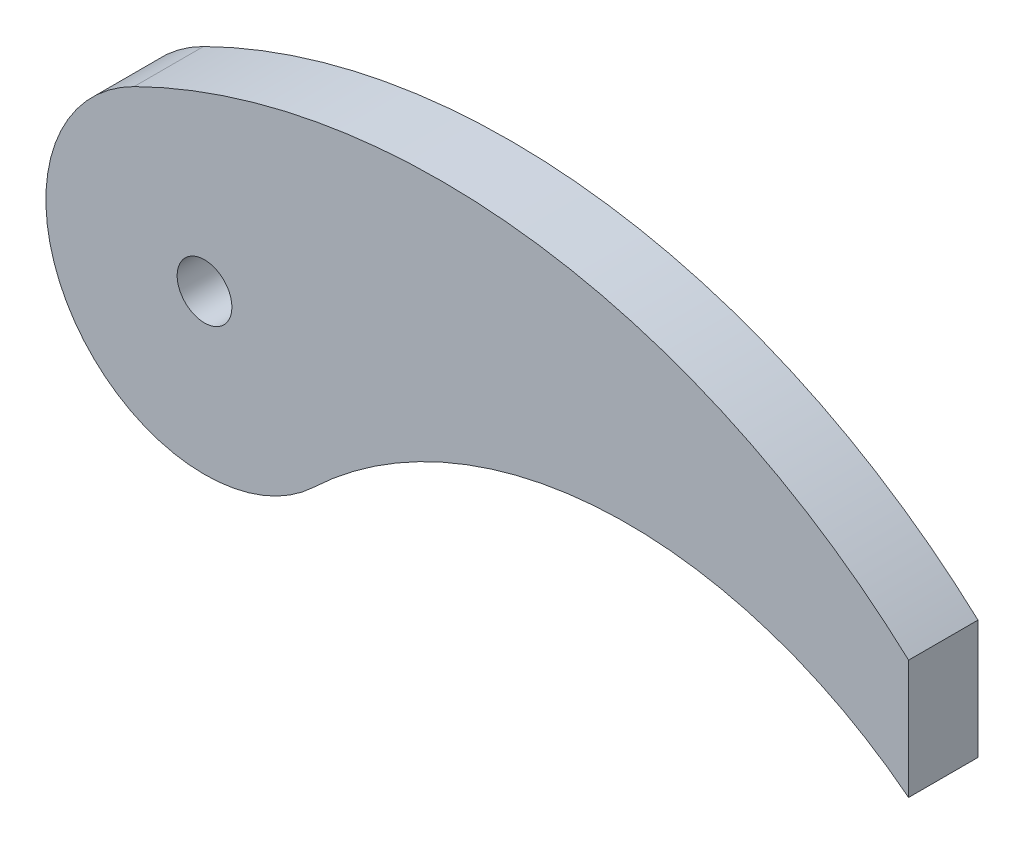
ISO-10303-21;
HEADER;
FILE_DESCRIPTION(('STEP AP214'),'2;1');
FILE_NAME('part.step','',(''),(''),'','','');
FILE_SCHEMA(('AUTOMOTIVE_DESIGN { 1 0 10303 214 1 1 1 1 }'));
ENDSEC;
DATA;
#1=APPLICATION_CONTEXT('core data for automotive mechanical design processes');
#2=APPLICATION_PROTOCOL_DEFINITION('international standard','automotive_design',2000,#1);
#3=PRODUCT_CONTEXT('',#1,'mechanical');
#4=PRODUCT('Part','Part','',(#3));
#5=PRODUCT_RELATED_PRODUCT_CATEGORY('part','',(#4));
#6=PRODUCT_DEFINITION_FORMATION('','',#4);
#7=PRODUCT_DEFINITION_CONTEXT('part definition',#1,'design');
#8=PRODUCT_DEFINITION('design','',#6,#7);
#9=PRODUCT_DEFINITION_SHAPE('','',#8);
#10=(LENGTH_UNIT() NAMED_UNIT(*) SI_UNIT(.MILLI.,.METRE.));
#11=(NAMED_UNIT(*) PLANE_ANGLE_UNIT() SI_UNIT($,.RADIAN.));
#12=(NAMED_UNIT(*) SI_UNIT($,.STERADIAN.) SOLID_ANGLE_UNIT());
#13=UNCERTAINTY_MEASURE_WITH_UNIT(LENGTH_MEASURE(1.E-05),#10,'distance_accuracy_value','');
#14=(GEOMETRIC_REPRESENTATION_CONTEXT(3) GLOBAL_UNCERTAINTY_ASSIGNED_CONTEXT((#13)) GLOBAL_UNIT_ASSIGNED_CONTEXT((#10,
#11,#12)) REPRESENTATION_CONTEXT('',''));
#15=CARTESIAN_POINT('',(0.,0.,0.));
#16=DIRECTION('',(0.,0.,1.));
#17=DIRECTION('',(1.,0.,0.));
#18=AXIS2_PLACEMENT_3D('',#15,#16,#17);
#19=CARTESIAN_POINT('',(15.1734038962011,-30.6249165942692,4.445));
#20=DIRECTION('',(0.,0.,-1.));
#21=DIRECTION('',(-1.,0.,0.));
#22=AXIS2_PLACEMENT_3D('',#19,#20,#21);
#23=CYLINDRICAL_SURFACE('',#22,44.337736938001);
#24=CARTESIAN_POINT('',(15.1734038962011,-30.6249165942692,0.));
#25=DIRECTION('',(0.,0.,1.));
#26=DIRECTION('',(1.,0.,0.));
#27=AXIS2_PLACEMENT_3D('',#24,#25,#26);
#28=CIRCLE('',#27,44.337736938001);
#29=CARTESIAN_POINT('',(-4.51059073528056,9.10385474504076,0.));
#30=VERTEX_POINT('',#29);
#31=CARTESIAN_POINT('',(45.0970533237348,2.09220616616686,0.));
#32=VERTEX_POINT('',#31);
#33=EDGE_CURVE('E101',#30,#32,#28,.F.);
#34=ORIENTED_EDGE('',*,*,#33,.F.);
#35=DIRECTION('',(0.,0.,-1.));
#36=VECTOR('',#35,1.);
#37=CARTESIAN_POINT('',(-4.51059073528056,9.10385474504076,4.445));
#38=LINE('',#37,#36);
#39=CARTESIAN_POINT('',(-4.51059073528056,9.10385474504076,4.445));
#40=VERTEX_POINT('',#39);
#41=EDGE_CURVE('E11',#40,#30,#38,.T.);
#42=ORIENTED_EDGE('',*,*,#41,.F.);
#43=CARTESIAN_POINT('',(15.1734038962011,-30.6249165942692,4.445));
#44=DIRECTION('',(0.,0.,1.));
#45=DIRECTION('',(1.,0.,0.));
#46=AXIS2_PLACEMENT_3D('',#43,#44,#45);
#47=CIRCLE('',#46,44.337736938001);
#48=CARTESIAN_POINT('',(45.0970533237348,2.09220616616686,4.445));
#49=VERTEX_POINT('',#48);
#50=EDGE_CURVE('E83',#40,#49,#47,.F.);
#51=ORIENTED_EDGE('',*,*,#50,.T.);
#52=DIRECTION('',(0.,0.,-1.));
#53=VECTOR('',#52,1.);
#54=CARTESIAN_POINT('',(45.0970533237348,2.09220616616686,4.445));
#55=LINE('',#54,#53);
#56=EDGE_CURVE('E50',#49,#32,#55,.T.);
#57=ORIENTED_EDGE('',*,*,#56,.T.);
#58=EDGE_LOOP('',(#34,#42,#51,#57));
#59=FACE_BOUND('',#58,.T.);
#60=ADVANCED_FACE('F34',(#59),#23,.T.);
#61=CARTESIAN_POINT('',(0.,0.,4.445));
#62=DIRECTION('',(0.,0.,-1.));
#63=DIRECTION('',(-1.,0.,0.));
#64=AXIS2_PLACEMENT_3D('',#61,#62,#63);
#65=CYLINDRICAL_SURFACE('',#64,10.16);
#66=CARTESIAN_POINT('',(0.,0.,0.));
#67=DIRECTION('',(0.,0.,1.));
#68=DIRECTION('',(1.,0.,0.));
#69=AXIS2_PLACEMENT_3D('',#66,#67,#68);
#70=CIRCLE('',#69,10.16);
#71=CARTESIAN_POINT('',(6.99705332373475,-7.3666033410801,0.));
#72=VERTEX_POINT('',#71);
#73=EDGE_CURVE('E89',#30,#72,#70,.T.);
#74=ORIENTED_EDGE('',*,*,#73,.T.);
#75=DIRECTION('',(0.,0.,-1.));
#76=VECTOR('',#75,1.);
#77=CARTESIAN_POINT('',(6.99705332373475,-7.3666033410801,4.445));
#78=LINE('',#77,#76);
#79=CARTESIAN_POINT('',(6.99705332373475,-7.3666033410801,4.445));
#80=VERTEX_POINT('',#79);
#81=EDGE_CURVE('E42',#80,#72,#78,.T.);
#82=ORIENTED_EDGE('',*,*,#81,.F.);
#83=CARTESIAN_POINT('',(0.,0.,4.445));
#84=DIRECTION('',(0.,0.,1.));
#85=DIRECTION('',(1.,0.,0.));
#86=AXIS2_PLACEMENT_3D('',#83,#84,#85);
#87=CIRCLE('',#86,10.16);
#88=EDGE_CURVE('E76',#40,#80,#87,.T.);
#89=ORIENTED_EDGE('',*,*,#88,.F.);
#90=ORIENTED_EDGE('',*,*,#41,.T.);
#91=EDGE_LOOP('',(#74,#82,#89,#90));
#92=FACE_BOUND('',#91,.T.);
#93=ADVANCED_FACE('F87',(#92),#65,.T.);
#94=CARTESIAN_POINT('',(27.1135816294722,-28.5455879466854,4.445));
#95=DIRECTION('',(0.,0.,-1.));
#96=DIRECTION('',(-1.,0.,0.));
#97=AXIS2_PLACEMENT_3D('',#94,#95,#96);
#98=CYLINDRICAL_SURFACE('',#97,29.21);
#99=CARTESIAN_POINT('',(27.1135816294722,-28.5455879466854,0.));
#100=DIRECTION('',(0.,0.,1.));
#101=DIRECTION('',(1.,0.,0.));
#102=AXIS2_PLACEMENT_3D('',#99,#100,#101);
#103=CIRCLE('',#102,29.21);
#104=CARTESIAN_POINT('',(45.0970533237348,-5.52779383383314,0.));
#105=VERTEX_POINT('',#104);
#106=EDGE_CURVE('E104',#72,#105,#103,.F.);
#107=ORIENTED_EDGE('',*,*,#106,.T.);
#108=DIRECTION('',(0.,0.,-1.));
#109=VECTOR('',#108,1.);
#110=CARTESIAN_POINT('',(45.0970533237348,-5.52779383383314,4.445));
#111=LINE('',#110,#109);
#112=CARTESIAN_POINT('',(45.0970533237348,-5.52779383383314,4.445));
#113=VERTEX_POINT('',#112);
#114=EDGE_CURVE('E64',#113,#105,#111,.T.);
#115=ORIENTED_EDGE('',*,*,#114,.F.);
#116=CARTESIAN_POINT('',(27.1135816294722,-28.5455879466854,4.445));
#117=DIRECTION('',(0.,0.,1.));
#118=DIRECTION('',(1.,0.,0.));
#119=AXIS2_PLACEMENT_3D('',#116,#117,#118);
#120=CIRCLE('',#119,29.21);
#121=EDGE_CURVE('E82',#80,#113,#120,.F.);
#122=ORIENTED_EDGE('',*,*,#121,.F.);
#123=ORIENTED_EDGE('',*,*,#81,.T.);
#124=EDGE_LOOP('',(#107,#115,#122,#123));
#125=FACE_BOUND('',#124,.T.);
#126=ADVANCED_FACE('F92',(#125),#98,.F.);
#127=CARTESIAN_POINT('',(45.0970533237348,0.,4.445));
#128=DIRECTION('',(1.,0.,0.));
#129=DIRECTION('',(0.,0.,-1.));
#130=AXIS2_PLACEMENT_3D('',#127,#128,#129);
#131=PLANE('',#130);
#132=DIRECTION('',(0.,-1.,0.));
#133=VECTOR('',#132,1.);
#134=CARTESIAN_POINT('',(45.0970533237348,0.,0.));
#135=LINE('',#134,#133);
#136=EDGE_CURVE('E106',#32,#105,#135,.T.);
#137=ORIENTED_EDGE('',*,*,#136,.F.);
#138=ORIENTED_EDGE('',*,*,#56,.F.);
#139=DIRECTION('',(0.,-1.,0.));
#140=VECTOR('',#139,1.);
#141=CARTESIAN_POINT('',(45.0970533237348,0.,4.445));
#142=LINE('',#141,#140);
#143=EDGE_CURVE('E93',#49,#113,#142,.T.);
#144=ORIENTED_EDGE('',*,*,#143,.T.);
#145=ORIENTED_EDGE('',*,*,#114,.T.);
#146=EDGE_LOOP('',(#137,#138,#144,#145));
#147=FACE_BOUND('',#146,.T.);
#148=ADVANCED_FACE('F115',(#147),#131,.T.);
#149=CARTESIAN_POINT('',(0.,0.,4.445));
#150=DIRECTION('',(0.,0.,-1.));
#151=DIRECTION('',(-1.,0.,0.));
#152=AXIS2_PLACEMENT_3D('',#149,#150,#151);
#153=CYLINDRICAL_SURFACE('',#152,1.7526);
#154=CARTESIAN_POINT('',(0.,0.,4.445));
#155=DIRECTION('',(0.,0.,1.));
#156=DIRECTION('',(1.,0.,0.));
#157=AXIS2_PLACEMENT_3D('',#154,#155,#156);
#158=CIRCLE('',#157,1.7526);
#159=CARTESIAN_POINT('',(1.7526,0.,4.445));
#160=VERTEX_POINT('',#159);
#161=EDGE_CURVE('E95',#160,#160,#158,.T.);
#162=ORIENTED_EDGE('',*,*,#161,.T.);
#163=EDGE_LOOP('',(#162));
#164=FACE_BOUND('',#163,.T.);
#165=CARTESIAN_POINT('',(0.,0.,0.));
#166=DIRECTION('',(0.,0.,1.));
#167=DIRECTION('',(1.,0.,0.));
#168=AXIS2_PLACEMENT_3D('',#165,#166,#167);
#169=CIRCLE('',#168,1.7526);
#170=CARTESIAN_POINT('',(1.7526,0.,0.));
#171=VERTEX_POINT('',#170);
#172=EDGE_CURVE('E109',#171,#171,#169,.T.);
#173=ORIENTED_EDGE('',*,*,#172,.F.);
#174=EDGE_LOOP('',(#173));
#175=FACE_BOUND('',#174,.T.);
#176=ADVANCED_FACE('F117',(#164,#175),#153,.F.);
#177=CARTESIAN_POINT('',(0.,0.,4.445));
#178=DIRECTION('',(0.,0.,1.));
#179=DIRECTION('',(1.,0.,0.));
#180=AXIS2_PLACEMENT_3D('',#177,#178,#179);
#181=PLANE('',#180);
#182=ORIENTED_EDGE('',*,*,#50,.F.);
#183=ORIENTED_EDGE('',*,*,#88,.T.);
#184=ORIENTED_EDGE('',*,*,#121,.T.);
#185=ORIENTED_EDGE('',*,*,#143,.F.);
#186=EDGE_LOOP('',(#182,#183,#184,#185));
#187=FACE_BOUND('',#186,.T.);
#188=ORIENTED_EDGE('',*,*,#161,.F.);
#189=EDGE_LOOP('',(#188));
#190=FACE_BOUND('',#189,.T.);
#191=ADVANCED_FACE('F78',(#187,#190),#181,.T.);
#192=CARTESIAN_POINT('',(0.,0.,0.));
#193=DIRECTION('',(0.,0.,1.));
#194=DIRECTION('',(1.,0.,0.));
#195=AXIS2_PLACEMENT_3D('',#192,#193,#194);
#196=PLANE('',#195);
#197=ORIENTED_EDGE('',*,*,#33,.T.);
#198=ORIENTED_EDGE('',*,*,#136,.T.);
#199=ORIENTED_EDGE('',*,*,#106,.F.);
#200=ORIENTED_EDGE('',*,*,#73,.F.);
#201=EDGE_LOOP('',(#197,#198,#199,#200));
#202=FACE_BOUND('',#201,.T.);
#203=ORIENTED_EDGE('',*,*,#172,.T.);
#204=EDGE_LOOP('',(#203));
#205=FACE_BOUND('',#204,.T.);
#206=ADVANCED_FACE('F156',(#202,#205),#196,.F.);
#207=CLOSED_SHELL('',(#60,#93,#126,#148,#176,#191,#206));
#208=MANIFOLD_SOLID_BREP('B2',#207);
#209=ADVANCED_BREP_SHAPE_REPRESENTATION('',(#18,#208),#14);
#210=SHAPE_DEFINITION_REPRESENTATION(#9,#209);
ENDSEC;
END-ISO-10303-21;
